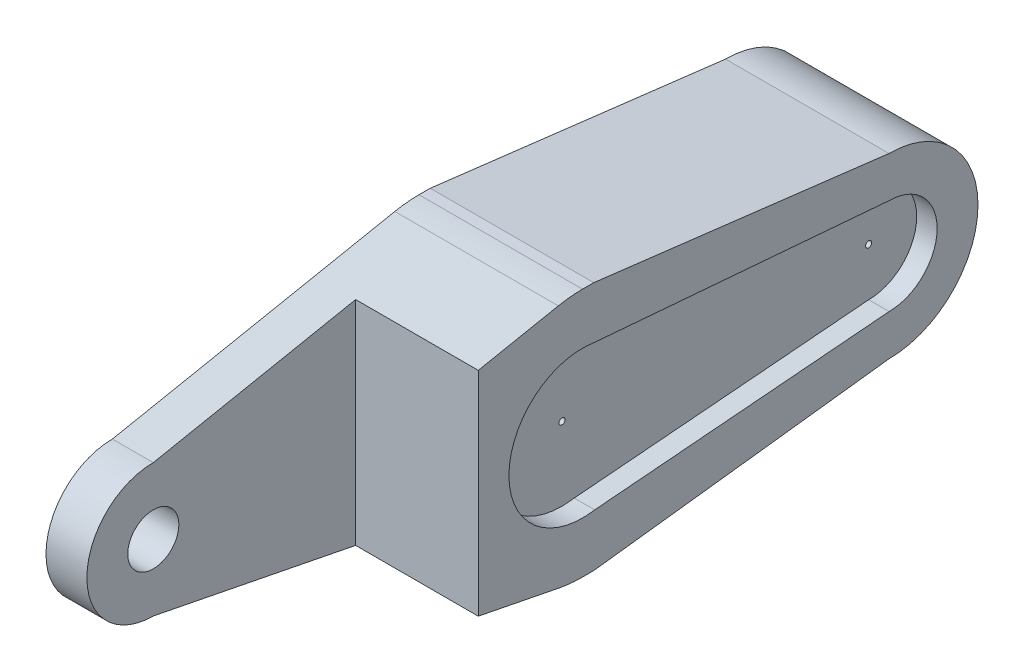
ISO-10303-21;
HEADER;
FILE_DESCRIPTION(('STEP AP214'),'2;1');
FILE_NAME('part.step','',(''),(''),'','','');
FILE_SCHEMA(('AUTOMOTIVE_DESIGN { 1 0 10303 214 1 1 1 1 }'));
ENDSEC;
DATA;
#1=APPLICATION_CONTEXT('core data for automotive mechanical design processes');
#2=APPLICATION_PROTOCOL_DEFINITION('international standard','automotive_design',2000,#1);
#3=PRODUCT_CONTEXT('',#1,'mechanical');
#4=PRODUCT('Part','Part','',(#3));
#5=PRODUCT_RELATED_PRODUCT_CATEGORY('part','',(#4));
#6=PRODUCT_DEFINITION_FORMATION('','',#4);
#7=PRODUCT_DEFINITION_CONTEXT('part definition',#1,'design');
#8=PRODUCT_DEFINITION('design','',#6,#7);
#9=PRODUCT_DEFINITION_SHAPE('','',#8);
#10=(LENGTH_UNIT() NAMED_UNIT(*) SI_UNIT(.MILLI.,.METRE.));
#11=(NAMED_UNIT(*) PLANE_ANGLE_UNIT() SI_UNIT($,.RADIAN.));
#12=(NAMED_UNIT(*) SI_UNIT($,.STERADIAN.) SOLID_ANGLE_UNIT());
#13=UNCERTAINTY_MEASURE_WITH_UNIT(LENGTH_MEASURE(1.E-05),#10,'distance_accuracy_value','');
#14=(GEOMETRIC_REPRESENTATION_CONTEXT(3) GLOBAL_UNCERTAINTY_ASSIGNED_CONTEXT((#13)) GLOBAL_UNIT_ASSIGNED_CONTEXT((#10,
#11,#12)) REPRESENTATION_CONTEXT('',''));
#15=CARTESIAN_POINT('',(0.,0.,0.));
#16=DIRECTION('',(0.,0.,1.));
#17=DIRECTION('',(1.,0.,0.));
#18=AXIS2_PLACEMENT_3D('',#15,#16,#17);
#19=CARTESIAN_POINT('',(8.,6.08869853330339,1.20486717000446));
#20=DIRECTION('',(0.,-0.980977484852086,-0.194121544948715));
#21=DIRECTION('',(0.,0.194121544948715,-0.980977484852086));
#22=AXIS2_PLACEMENT_3D('',#19,#20,#21);
#23=PLANE('',#22);
#24=DIRECTION('',(1.,0.,0.));
#25=VECTOR('',#24,1.);
#26=CARTESIAN_POINT('',(2.,5.20906972858001,5.65));
#27=LINE('',#26,#25);
#28=CARTESIAN_POINT('',(2.,5.20906972858001,5.65));
#29=VERTEX_POINT('',#28);
#30=CARTESIAN_POINT('',(8.,5.20906972858001,5.65));
#31=VERTEX_POINT('',#30);
#32=EDGE_CURVE('E179',#29,#31,#27,.T.);
#33=ORIENTED_EDGE('',*,*,#32,.T.);
#34=DIRECTION('',(0.,-0.194121544948715,0.980977484852086));
#35=VECTOR('',#34,1.);
#36=CARTESIAN_POINT('',(8.,6.08869853330339,1.20486717000446));
#37=LINE('',#36,#35);
#38=CARTESIAN_POINT('',(8.,5.98396265759772,1.73414142418716));
#39=VERTEX_POINT('',#38);
#40=EDGE_CURVE('E296',#39,#31,#37,.T.);
#41=ORIENTED_EDGE('',*,*,#40,.F.);
#42=DIRECTION('',(-1.,0.,0.));
#43=VECTOR('',#42,1.);
#44=CARTESIAN_POINT('',(8.,5.98396265759772,1.73414142418716));
#45=LINE('',#44,#43);
#46=CARTESIAN_POINT('',(0.,5.98396265759772,1.73414142418716));
#47=VERTEX_POINT('',#46);
#48=EDGE_CURVE('E57',#39,#47,#45,.T.);
#49=ORIENTED_EDGE('',*,*,#48,.T.);
#50=DIRECTION('',(0.,-0.194121544948715,0.980977484852086));
#51=VECTOR('',#50,1.);
#52=CARTESIAN_POINT('',(0.,6.08869853330339,1.20486717000446));
#53=LINE('',#52,#51);
#54=CARTESIAN_POINT('',(0.,3.25,15.55));
#55=VERTEX_POINT('',#54);
#56=EDGE_CURVE('E334',#47,#55,#53,.T.);
#57=ORIENTED_EDGE('',*,*,#56,.T.);
#58=DIRECTION('',(-1.,0.,0.));
#59=VECTOR('',#58,1.);
#60=CARTESIAN_POINT('',(8.,3.25,15.55));
#61=LINE('',#60,#59);
#62=CARTESIAN_POINT('',(2.,3.25,15.55));
#63=VERTEX_POINT('',#62);
#64=EDGE_CURVE('E203',#63,#55,#61,.T.);
#65=ORIENTED_EDGE('',*,*,#64,.F.);
#66=DIRECTION('',(0.,-0.194121544948715,0.980977484852086));
#67=VECTOR('',#66,1.);
#68=CARTESIAN_POINT('',(2.,6.08869853330339,1.20486717000446));
#69=LINE('',#68,#67);
#70=EDGE_CURVE('E195',#29,#63,#69,.T.);
#71=ORIENTED_EDGE('',*,*,#70,.F.);
#72=EDGE_LOOP('',(#33,#41,#49,#57,#65,#71));
#73=FACE_BOUND('',#72,.T.);
#74=ADVANCED_FACE('F47',(#73),#23,.F.);
#75=CARTESIAN_POINT('',(8.,0.,15.55));
#76=DIRECTION('',(-1.,0.,0.));
#77=DIRECTION('',(0.,0.,1.));
#78=AXIS2_PLACEMENT_3D('',#75,#76,#77);
#79=CYLINDRICAL_SURFACE('',#78,3.25);
#80=CARTESIAN_POINT('',(2.,0.,15.55));
#81=DIRECTION('',(1.,0.,0.));
#82=DIRECTION('',(0.,0.,-1.));
#83=AXIS2_PLACEMENT_3D('',#80,#81,#82);
#84=CIRCLE('',#83,3.25);
#85=CARTESIAN_POINT('',(2.,-3.25,15.55));
#86=VERTEX_POINT('',#85);
#87=EDGE_CURVE('E205',#63,#86,#84,.T.);
#88=ORIENTED_EDGE('',*,*,#87,.F.);
#89=ORIENTED_EDGE('',*,*,#64,.T.);
#90=CARTESIAN_POINT('',(0.,0.,15.55));
#91=DIRECTION('',(1.,0.,0.));
#92=DIRECTION('',(0.,0.,-1.));
#93=AXIS2_PLACEMENT_3D('',#90,#91,#92);
#94=CIRCLE('',#93,3.25);
#95=CARTESIAN_POINT('',(0.,-3.25,15.55));
#96=VERTEX_POINT('',#95);
#97=EDGE_CURVE('E337',#55,#96,#94,.T.);
#98=ORIENTED_EDGE('',*,*,#97,.T.);
#99=DIRECTION('',(-1.,0.,0.));
#100=VECTOR('',#99,1.);
#101=CARTESIAN_POINT('',(8.,-3.25,15.55));
#102=LINE('',#101,#100);
#103=EDGE_CURVE('E382',#86,#96,#102,.T.);
#104=ORIENTED_EDGE('',*,*,#103,.F.);
#105=EDGE_LOOP('',(#88,#89,#98,#104));
#106=FACE_BOUND('',#105,.T.);
#107=ADVANCED_FACE('F477',(#106),#79,.T.);
#108=CARTESIAN_POINT('',(8.,-6.08869853330339,1.20486717000446));
#109=DIRECTION('',(0.,0.980977484852086,-0.194121544948715));
#110=DIRECTION('',(0.,0.194121544948715,0.980977484852086));
#111=AXIS2_PLACEMENT_3D('',#108,#109,#110);
#112=PLANE('',#111);
#113=DIRECTION('',(1.,0.,0.));
#114=VECTOR('',#113,1.);
#115=CARTESIAN_POINT('',(2.,-5.20906972858001,5.65));
#116=LINE('',#115,#114);
#117=CARTESIAN_POINT('',(2.,-5.20906972858001,5.65));
#118=VERTEX_POINT('',#117);
#119=CARTESIAN_POINT('',(8.,-5.20906972858001,5.65));
#120=VERTEX_POINT('',#119);
#121=EDGE_CURVE('E65',#118,#120,#116,.T.);
#122=ORIENTED_EDGE('',*,*,#121,.F.);
#123=DIRECTION('',(0.,-0.194121544948715,-0.980977484852086));
#124=VECTOR('',#123,1.);
#125=CARTESIAN_POINT('',(2.,-6.08869853330339,1.20486717000446));
#126=LINE('',#125,#124);
#127=EDGE_CURVE('E198',#86,#118,#126,.T.);
#128=ORIENTED_EDGE('',*,*,#127,.F.);
#129=ORIENTED_EDGE('',*,*,#103,.T.);
#130=DIRECTION('',(0.,-0.194121544948715,-0.980977484852086));
#131=VECTOR('',#130,1.);
#132=CARTESIAN_POINT('',(0.,-6.08869853330339,1.20486717000446));
#133=LINE('',#132,#131);
#134=CARTESIAN_POINT('',(0.,-5.98396265759773,1.73414142418716));
#135=VERTEX_POINT('',#134);
#136=EDGE_CURVE('E341',#96,#135,#133,.T.);
#137=ORIENTED_EDGE('',*,*,#136,.T.);
#138=DIRECTION('',(-1.,0.,0.));
#139=VECTOR('',#138,1.);
#140=CARTESIAN_POINT('',(8.,-5.98396265759773,1.73414142418716));
#141=LINE('',#140,#139);
#142=CARTESIAN_POINT('',(8.,-5.98396265759773,1.73414142418716));
#143=VERTEX_POINT('',#142);
#144=EDGE_CURVE('E378',#143,#135,#141,.T.);
#145=ORIENTED_EDGE('',*,*,#144,.F.);
#146=DIRECTION('',(0.,-0.194121544948715,-0.980977484852086));
#147=VECTOR('',#146,1.);
#148=CARTESIAN_POINT('',(8.,-6.08869853330339,1.20486717000446));
#149=LINE('',#148,#147);
#150=EDGE_CURVE('E299',#120,#143,#149,.T.);
#151=ORIENTED_EDGE('',*,*,#150,.F.);
#152=EDGE_LOOP('',(#122,#128,#129,#137,#145,#151));
#153=FACE_BOUND('',#152,.T.);
#154=ADVANCED_FACE('F473',(#153),#112,.F.);
#155=CARTESIAN_POINT('',(8.,0.,15.55));
#156=DIRECTION('',(-1.,0.,0.));
#157=DIRECTION('',(0.,0.,1.));
#158=AXIS2_PLACEMENT_3D('',#155,#156,#157);
#159=CYLINDRICAL_SURFACE('',#158,1.25);
#160=CARTESIAN_POINT('',(0.,0.,15.55));
#161=DIRECTION('',(1.,0.,0.));
#162=DIRECTION('',(0.,0.,-1.));
#163=AXIS2_PLACEMENT_3D('',#160,#161,#162);
#164=CIRCLE('',#163,1.25);
#165=CARTESIAN_POINT('',(0.,0.,14.3));
#166=VERTEX_POINT('',#165);
#167=EDGE_CURVE('E271',#166,#166,#164,.T.);
#168=ORIENTED_EDGE('',*,*,#167,.F.);
#169=EDGE_LOOP('',(#168));
#170=FACE_BOUND('',#169,.T.);
#171=CARTESIAN_POINT('',(2.,0.,15.55));
#172=DIRECTION('',(1.,0.,0.));
#173=DIRECTION('',(0.,0.,-1.));
#174=AXIS2_PLACEMENT_3D('',#171,#172,#173);
#175=CIRCLE('',#174,1.25);
#176=CARTESIAN_POINT('',(2.,0.,14.3));
#177=VERTEX_POINT('',#176);
#178=EDGE_CURVE('E190',#177,#177,#175,.F.);
#179=ORIENTED_EDGE('',*,*,#178,.F.);
#180=EDGE_LOOP('',(#179));
#181=FACE_BOUND('',#180,.T.);
#182=ADVANCED_FACE('F49',(#170,#181),#159,.F.);
#183=CARTESIAN_POINT('',(8.,0.,0.));
#184=DIRECTION('',(1.,0.,0.));
#185=DIRECTION('',(0.,0.,-1.));
#186=AXIS2_PLACEMENT_3D('',#183,#184,#185);
#187=PLANE('',#186);
#188=CARTESIAN_POINT('',(8.,0.,-14.45));
#189=DIRECTION('',(1.,0.,0.));
#190=DIRECTION('',(0.,0.,-1.));
#191=AXIS2_PLACEMENT_3D('',#188,#189,#190);
#192=CIRCLE('',#191,2.35);
#193=CARTESIAN_POINT('',(8.,-2.35,-14.45));
#194=VERTEX_POINT('',#193);
#195=CARTESIAN_POINT('',(8.,2.35,-14.45));
#196=VERTEX_POINT('',#195);
#197=EDGE_CURVE('E272',#194,#196,#192,.T.);
#198=ORIENTED_EDGE('',*,*,#197,.F.);
#199=DIRECTION('',(0.,0.08304547985374,-0.99654575824488));
#200=VECTOR('',#199,1.);
#201=CARTESIAN_POINT('',(8.,-3.52965517241379,-0.294137931034483));
#202=LINE('',#201,#200);
#203=CARTESIAN_POINT('',(8.,-3.55034482758621,-0.0458620689654945));
#204=VERTEX_POINT('',#203);
#205=EDGE_CURVE('E276',#204,#194,#202,.T.);
#206=ORIENTED_EDGE('',*,*,#205,.F.);
#207=CARTESIAN_POINT('',(8.,0.,0.549999999999999));
#208=DIRECTION('',(1.,0.,0.));
#209=DIRECTION('',(0.,0.,-1.));
#210=AXIS2_PLACEMENT_3D('',#207,#208,#209);
#211=CIRCLE('',#210,3.6);
#212=CARTESIAN_POINT('',(8.,3.55034482758621,-0.0458620689654861));
#213=VERTEX_POINT('',#212);
#214=EDGE_CURVE('E281',#213,#204,#211,.T.);
#215=ORIENTED_EDGE('',*,*,#214,.F.);
#216=DIRECTION('',(0.,0.08304547985374,0.99654575824488));
#217=VECTOR('',#216,1.);
#218=CARTESIAN_POINT('',(8.,3.52965517241379,-0.294137931034483));
#219=LINE('',#218,#217);
#220=EDGE_CURVE('E285',#196,#213,#219,.T.);
#221=ORIENTED_EDGE('',*,*,#220,.F.);
#222=EDGE_LOOP('',(#198,#206,#215,#221));
#223=FACE_BOUND('',#222,.T.);
#224=ORIENTED_EDGE('',*,*,#40,.T.);
#225=DIRECTION('',(0.,-1.,0.));
#226=VECTOR('',#225,1.);
#227=CARTESIAN_POINT('',(8.,0.,5.65));
#228=LINE('',#227,#226);
#229=EDGE_CURVE('E184',#31,#120,#228,.T.);
#230=ORIENTED_EDGE('',*,*,#229,.T.);
#231=ORIENTED_EDGE('',*,*,#150,.T.);
#232=CARTESIAN_POINT('',(8.,0.,0.549999999999999));
#233=DIRECTION('',(1.,0.,0.));
#234=DIRECTION('',(0.,0.,-1.));
#235=AXIS2_PLACEMENT_3D('',#232,#233,#234);
#236=CIRCLE('',#235,6.1);
#237=CARTESIAN_POINT('',(8.,-6.1,0.549999999999999));
#238=VERTEX_POINT('',#237);
#239=EDGE_CURVE('E302',#143,#238,#236,.T.);
#240=ORIENTED_EDGE('',*,*,#239,.T.);
#241=DIRECTION('',(0.,0.,1.));
#242=VECTOR('',#241,1.);
#243=CARTESIAN_POINT('',(8.,-6.1,0.));
#244=LINE('',#243,#242);
#245=CARTESIAN_POINT('',(8.,-6.1,0.));
#246=VERTEX_POINT('',#245);
#247=EDGE_CURVE('E305',#246,#238,#244,.T.);
#248=ORIENTED_EDGE('',*,*,#247,.F.);
#249=DIRECTION('',(0.,0.12022877994105,-0.992746211513238));
#250=VECTOR('',#249,1.);
#251=CARTESIAN_POINT('',(8.,-6.01182474689071,-0.728075661388148));
#252=LINE('',#251,#250);
#253=CARTESIAN_POINT('',(8.,-4.35,-14.45));
#254=VERTEX_POINT('',#253);
#255=EDGE_CURVE('E309',#246,#254,#252,.T.);
#256=ORIENTED_EDGE('',*,*,#255,.T.);
#257=CARTESIAN_POINT('',(8.,0.,-14.45));
#258=DIRECTION('',(1.,0.,0.));
#259=DIRECTION('',(0.,0.,-1.));
#260=AXIS2_PLACEMENT_3D('',#257,#258,#259);
#261=CIRCLE('',#260,4.35);
#262=CARTESIAN_POINT('',(8.,4.35,-14.45));
#263=VERTEX_POINT('',#262);
#264=EDGE_CURVE('E312',#254,#263,#261,.T.);
#265=ORIENTED_EDGE('',*,*,#264,.T.);
#266=DIRECTION('',(0.,0.12022877994105,0.992746211513238));
#267=VECTOR('',#266,1.);
#268=CARTESIAN_POINT('',(8.,6.01182474689071,-0.728075661388148));
#269=LINE('',#268,#267);
#270=CARTESIAN_POINT('',(8.,6.1,0.));
#271=VERTEX_POINT('',#270);
#272=EDGE_CURVE('E315',#263,#271,#269,.T.);
#273=ORIENTED_EDGE('',*,*,#272,.T.);
#274=DIRECTION('',(0.,0.,1.));
#275=VECTOR('',#274,1.);
#276=CARTESIAN_POINT('',(8.,6.1,0.));
#277=LINE('',#276,#275);
#278=CARTESIAN_POINT('',(8.,6.1,0.549999999999999));
#279=VERTEX_POINT('',#278);
#280=EDGE_CURVE('E289',#271,#279,#277,.T.);
#281=ORIENTED_EDGE('',*,*,#280,.T.);
#282=CARTESIAN_POINT('',(8.,0.,0.549999999999999));
#283=DIRECTION('',(1.,0.,0.));
#284=DIRECTION('',(0.,0.,-1.));
#285=AXIS2_PLACEMENT_3D('',#282,#283,#284);
#286=CIRCLE('',#285,6.1);
#287=EDGE_CURVE('E293',#279,#39,#286,.T.);
#288=ORIENTED_EDGE('',*,*,#287,.T.);
#289=EDGE_LOOP('',(#224,#230,#231,#240,#248,#256,#265,#273,#281,#288));
#290=FACE_BOUND('',#289,.T.);
#291=ADVANCED_FACE('F412',(#223,#290),#187,.T.);
#292=CARTESIAN_POINT('',(8.,0.,0.549999999999999));
#293=DIRECTION('',(-1.,0.,0.));
#294=DIRECTION('',(0.,0.,1.));
#295=AXIS2_PLACEMENT_3D('',#292,#293,#294);
#296=CYLINDRICAL_SURFACE('',#295,3.6);
#297=CARTESIAN_POINT('',(0.,0.,0.549999999999999));
#298=DIRECTION('',(1.,0.,0.));
#299=DIRECTION('',(0.,0.,-1.));
#300=AXIS2_PLACEMENT_3D('',#297,#298,#299);
#301=CIRCLE('',#300,3.6);
#302=CARTESIAN_POINT('',(0.,-3.6,0.549999999999999));
#303=VERTEX_POINT('',#302);
#304=CARTESIAN_POINT('',(0.,-3.55034482758621,-0.045862068965486));
#305=VERTEX_POINT('',#304);
#306=EDGE_CURVE('E322',#303,#305,#301,.T.);
#307=ORIENTED_EDGE('',*,*,#306,.F.);
#308=DIRECTION('',(-1.,0.,0.));
#309=VECTOR('',#308,1.);
#310=CARTESIAN_POINT('',(7.,-3.6,0.549999999999999));
#311=LINE('',#310,#309);
#312=CARTESIAN_POINT('',(7.,-3.6,0.549999999999999));
#313=VERTEX_POINT('',#312);
#314=EDGE_CURVE('E251',#313,#303,#311,.T.);
#315=ORIENTED_EDGE('',*,*,#314,.F.);
#316=CARTESIAN_POINT('',(7.,0.,0.549999999999999));
#317=DIRECTION('',(1.,0.,0.));
#318=DIRECTION('',(0.,0.,-1.));
#319=AXIS2_PLACEMENT_3D('',#316,#317,#318);
#320=CIRCLE('',#319,3.6);
#321=CARTESIAN_POINT('',(7.,3.6,0.549999999999999));
#322=VERTEX_POINT('',#321);
#323=EDGE_CURVE('E248',#322,#313,#320,.T.);
#324=ORIENTED_EDGE('',*,*,#323,.F.);
#325=DIRECTION('',(-1.,0.,0.));
#326=VECTOR('',#325,1.);
#327=CARTESIAN_POINT('',(7.,3.6,0.549999999999999));
#328=LINE('',#327,#326);
#329=CARTESIAN_POINT('',(0.,3.6,0.549999999999999));
#330=VERTEX_POINT('',#329);
#331=EDGE_CURVE('E259',#322,#330,#328,.T.);
#332=ORIENTED_EDGE('',*,*,#331,.T.);
#333=CARTESIAN_POINT('',(0.,3.55034482758621,-0.0458620689654861));
#334=VERTEX_POINT('',#333);
#335=EDGE_CURVE('E323',#334,#330,#301,.T.);
#336=ORIENTED_EDGE('',*,*,#335,.F.);
#337=DIRECTION('',(-1.,0.,0.));
#338=VECTOR('',#337,1.);
#339=CARTESIAN_POINT('',(8.,3.55034482758621,-0.0458620689654804));
#340=LINE('',#339,#338);
#341=CARTESIAN_POINT('',(7.,3.55034482758621,-0.0458620689654861));
#342=VERTEX_POINT('',#341);
#343=EDGE_CURVE('E263',#334,#342,#340,.F.);
#344=ORIENTED_EDGE('',*,*,#343,.T.);
#345=DIRECTION('',(-1.,0.,0.));
#346=VECTOR('',#345,1.);
#347=CARTESIAN_POINT('',(8.,3.55034482758621,-0.0458620689654861));
#348=LINE('',#347,#346);
#349=EDGE_CURVE('E393',#213,#342,#348,.T.);
#350=ORIENTED_EDGE('',*,*,#349,.F.);
#351=ORIENTED_EDGE('',*,*,#214,.T.);
#352=DIRECTION('',(-1.,0.,0.));
#353=VECTOR('',#352,1.);
#354=CARTESIAN_POINT('',(8.,-3.55034482758621,-0.0458620689654945));
#355=LINE('',#354,#353);
#356=CARTESIAN_POINT('',(7.,-3.55034482758621,-0.0458620689654945));
#357=VERTEX_POINT('',#356);
#358=EDGE_CURVE('E396',#204,#357,#355,.T.);
#359=ORIENTED_EDGE('',*,*,#358,.T.);
#360=DIRECTION('',(-1.,0.,0.));
#361=VECTOR('',#360,1.);
#362=CARTESIAN_POINT('',(8.,-3.55034482758621,-0.0458620689654888));
#363=LINE('',#362,#361);
#364=EDGE_CURVE('E267',#357,#305,#363,.T.);
#365=ORIENTED_EDGE('',*,*,#364,.T.);
#366=EDGE_LOOP('',(#307,#315,#324,#332,#336,#344,#350,#351,#359,#365));
#367=FACE_BOUND('',#366,.T.);
#368=ADVANCED_FACE('F424',(#367),#296,.F.);
#369=CARTESIAN_POINT('',(8.,6.1,0.));
#370=DIRECTION('',(0.,-1.,0.));
#371=DIRECTION('',(0.,0.,-1.));
#372=AXIS2_PLACEMENT_3D('',#369,#370,#371);
#373=PLANE('',#372);
#374=DIRECTION('',(0.,0.,1.));
#375=VECTOR('',#374,1.);
#376=CARTESIAN_POINT('',(0.,6.1,0.));
#377=LINE('',#376,#375);
#378=CARTESIAN_POINT('',(0.,6.1,0.));
#379=VERTEX_POINT('',#378);
#380=CARTESIAN_POINT('',(0.,6.1,0.549999999999999));
#381=VERTEX_POINT('',#380);
#382=EDGE_CURVE('E327',#379,#381,#377,.T.);
#383=ORIENTED_EDGE('',*,*,#382,.T.);
#384=DIRECTION('',(-1.,0.,0.));
#385=VECTOR('',#384,1.);
#386=CARTESIAN_POINT('',(8.,6.1,0.549999999999999));
#387=LINE('',#386,#385);
#388=EDGE_CURVE('E12',#279,#381,#387,.T.);
#389=ORIENTED_EDGE('',*,*,#388,.F.);
#390=ORIENTED_EDGE('',*,*,#280,.F.);
#391=DIRECTION('',(-1.,0.,0.));
#392=VECTOR('',#391,1.);
#393=CARTESIAN_POINT('',(8.,6.1,0.));
#394=LINE('',#393,#392);
#395=EDGE_CURVE('E360',#271,#379,#394,.T.);
#396=ORIENTED_EDGE('',*,*,#395,.T.);
#397=EDGE_LOOP('',(#383,#389,#390,#396));
#398=FACE_BOUND('',#397,.T.);
#399=ADVANCED_FACE('F447',(#398),#373,.F.);
#400=CARTESIAN_POINT('',(8.,0.,0.549999999999999));
#401=DIRECTION('',(-1.,0.,0.));
#402=DIRECTION('',(0.,0.,1.));
#403=AXIS2_PLACEMENT_3D('',#400,#401,#402);
#404=CYLINDRICAL_SURFACE('',#403,6.1);
#405=CARTESIAN_POINT('',(0.,0.,0.549999999999999));
#406=DIRECTION('',(1.,0.,0.));
#407=DIRECTION('',(0.,0.,-1.));
#408=AXIS2_PLACEMENT_3D('',#405,#406,#407);
#409=CIRCLE('',#408,6.1);
#410=EDGE_CURVE('E331',#381,#47,#409,.T.);
#411=ORIENTED_EDGE('',*,*,#410,.T.);
#412=ORIENTED_EDGE('',*,*,#48,.F.);
#413=ORIENTED_EDGE('',*,*,#287,.F.);
#414=ORIENTED_EDGE('',*,*,#388,.T.);
#415=EDGE_LOOP('',(#411,#412,#413,#414));
#416=FACE_BOUND('',#415,.T.);
#417=ADVANCED_FACE('F480',(#416),#404,.T.);
#418=CARTESIAN_POINT('',(8.,0.,0.549999999999999));
#419=DIRECTION('',(-1.,0.,0.));
#420=DIRECTION('',(0.,0.,1.));
#421=AXIS2_PLACEMENT_3D('',#418,#419,#420);
#422=CYLINDRICAL_SURFACE('',#421,6.1);
#423=CARTESIAN_POINT('',(0.,0.,0.549999999999999));
#424=DIRECTION('',(1.,0.,0.));
#425=DIRECTION('',(0.,0.,-1.));
#426=AXIS2_PLACEMENT_3D('',#423,#424,#425);
#427=CIRCLE('',#426,6.1);
#428=CARTESIAN_POINT('',(0.,-6.1,0.549999999999999));
#429=VERTEX_POINT('',#428);
#430=EDGE_CURVE('E344',#135,#429,#427,.T.);
#431=ORIENTED_EDGE('',*,*,#430,.T.);
#432=DIRECTION('',(-1.,0.,0.));
#433=VECTOR('',#432,1.);
#434=CARTESIAN_POINT('',(8.,-6.1,0.549999999999999));
#435=LINE('',#434,#433);
#436=EDGE_CURVE('E375',#238,#429,#435,.T.);
#437=ORIENTED_EDGE('',*,*,#436,.F.);
#438=ORIENTED_EDGE('',*,*,#239,.F.);
#439=ORIENTED_EDGE('',*,*,#144,.T.);
#440=EDGE_LOOP('',(#431,#437,#438,#439));
#441=FACE_BOUND('',#440,.T.);
#442=ADVANCED_FACE('F468',(#441),#422,.T.);
#443=CARTESIAN_POINT('',(8.,-6.1,0.));
#444=DIRECTION('',(0.,-1.,0.));
#445=DIRECTION('',(0.,0.,-1.));
#446=AXIS2_PLACEMENT_3D('',#443,#444,#445);
#447=PLANE('',#446);
#448=DIRECTION('',(0.,0.,1.));
#449=VECTOR('',#448,1.);
#450=CARTESIAN_POINT('',(0.,-6.1,0.));
#451=LINE('',#450,#449);
#452=CARTESIAN_POINT('',(0.,-6.1,0.));
#453=VERTEX_POINT('',#452);
#454=EDGE_CURVE('E348',#453,#429,#451,.T.);
#455=ORIENTED_EDGE('',*,*,#454,.F.);
#456=DIRECTION('',(-1.,0.,0.));
#457=VECTOR('',#456,1.);
#458=CARTESIAN_POINT('',(8.,-6.1,0.));
#459=LINE('',#458,#457);
#460=EDGE_CURVE('E372',#246,#453,#459,.T.);
#461=ORIENTED_EDGE('',*,*,#460,.F.);
#462=ORIENTED_EDGE('',*,*,#247,.T.);
#463=ORIENTED_EDGE('',*,*,#436,.T.);
#464=EDGE_LOOP('',(#455,#461,#462,#463));
#465=FACE_BOUND('',#464,.T.);
#466=ADVANCED_FACE('F462',(#465),#447,.T.);
#467=CARTESIAN_POINT('',(8.,-6.01182474689071,-0.728075661388148));
#468=DIRECTION('',(0.,0.992746211513238,0.12022877994105));
#469=DIRECTION('',(0.,-0.12022877994105,0.992746211513238));
#470=AXIS2_PLACEMENT_3D('',#467,#468,#469);
#471=PLANE('',#470);
#472=DIRECTION('',(0.,0.12022877994105,-0.992746211513238));
#473=VECTOR('',#472,1.);
#474=CARTESIAN_POINT('',(0.,-6.01182474689071,-0.728075661388148));
#475=LINE('',#474,#473);
#476=CARTESIAN_POINT('',(0.,-4.35,-14.45));
#477=VERTEX_POINT('',#476);
#478=EDGE_CURVE('E352',#453,#477,#475,.T.);
#479=ORIENTED_EDGE('',*,*,#478,.T.);
#480=DIRECTION('',(-1.,0.,0.));
#481=VECTOR('',#480,1.);
#482=CARTESIAN_POINT('',(8.,-4.35,-14.45));
#483=LINE('',#482,#481);
#484=EDGE_CURVE('E368',#254,#477,#483,.T.);
#485=ORIENTED_EDGE('',*,*,#484,.F.);
#486=ORIENTED_EDGE('',*,*,#255,.F.);
#487=ORIENTED_EDGE('',*,*,#460,.T.);
#488=EDGE_LOOP('',(#479,#485,#486,#487));
#489=FACE_BOUND('',#488,.T.);
#490=ADVANCED_FACE('F481',(#489),#471,.F.);
#491=CARTESIAN_POINT('',(8.,0.,-14.45));
#492=DIRECTION('',(-1.,0.,0.));
#493=DIRECTION('',(0.,0.,1.));
#494=AXIS2_PLACEMENT_3D('',#491,#492,#493);
#495=CYLINDRICAL_SURFACE('',#494,4.35);
#496=CARTESIAN_POINT('',(0.,0.,-14.45));
#497=DIRECTION('',(1.,0.,0.));
#498=DIRECTION('',(0.,0.,-1.));
#499=AXIS2_PLACEMENT_3D('',#496,#497,#498);
#500=CIRCLE('',#499,4.35);
#501=CARTESIAN_POINT('',(0.,4.35,-14.45));
#502=VERTEX_POINT('',#501);
#503=EDGE_CURVE('E355',#477,#502,#500,.T.);
#504=ORIENTED_EDGE('',*,*,#503,.T.);
#505=DIRECTION('',(-1.,0.,0.));
#506=VECTOR('',#505,1.);
#507=CARTESIAN_POINT('',(8.,4.35,-14.45));
#508=LINE('',#507,#506);
#509=EDGE_CURVE('E364',#263,#502,#508,.T.);
#510=ORIENTED_EDGE('',*,*,#509,.F.);
#511=ORIENTED_EDGE('',*,*,#264,.F.);
#512=ORIENTED_EDGE('',*,*,#484,.T.);
#513=EDGE_LOOP('',(#504,#510,#511,#512));
#514=FACE_BOUND('',#513,.T.);
#515=ADVANCED_FACE('F455',(#514),#495,.T.);
#516=CARTESIAN_POINT('',(8.,0.,-14.45));
#517=DIRECTION('',(-1.,0.,0.));
#518=DIRECTION('',(0.,0.,1.));
#519=AXIS2_PLACEMENT_3D('',#516,#517,#518);
#520=CYLINDRICAL_SURFACE('',#519,2.35);
#521=CARTESIAN_POINT('',(7.,0.,-14.45));
#522=DIRECTION('',(1.,0.,0.));
#523=DIRECTION('',(0.,0.,-1.));
#524=AXIS2_PLACEMENT_3D('',#521,#522,#523);
#525=CIRCLE('',#524,2.35);
#526=CARTESIAN_POINT('',(7.,-2.35,-14.45));
#527=VERTEX_POINT('',#526);
#528=CARTESIAN_POINT('',(7.,2.35,-14.45));
#529=VERTEX_POINT('',#528);
#530=EDGE_CURVE('E239',#527,#529,#525,.T.);
#531=ORIENTED_EDGE('',*,*,#530,.F.);
#532=DIRECTION('',(-1.,0.,0.));
#533=VECTOR('',#532,1.);
#534=CARTESIAN_POINT('',(8.,-2.35,-14.45));
#535=LINE('',#534,#533);
#536=EDGE_CURVE('E51',#194,#527,#535,.T.);
#537=ORIENTED_EDGE('',*,*,#536,.F.);
#538=ORIENTED_EDGE('',*,*,#197,.T.);
#539=DIRECTION('',(-1.,0.,0.));
#540=VECTOR('',#539,1.);
#541=CARTESIAN_POINT('',(8.,2.35,-14.45));
#542=LINE('',#541,#540);
#543=EDGE_CURVE('E318',#196,#529,#542,.T.);
#544=ORIENTED_EDGE('',*,*,#543,.T.);
#545=EDGE_LOOP('',(#531,#537,#538,#544));
#546=FACE_BOUND('',#545,.T.);
#547=ADVANCED_FACE('F409',(#546),#520,.F.);
#548=CARTESIAN_POINT('',(8.,-3.52965517241379,-0.294137931034483));
#549=DIRECTION('',(0.,0.99654575824488,0.0830454798537399));
#550=DIRECTION('',(0.,-0.08304547985374,0.99654575824488));
#551=AXIS2_PLACEMENT_3D('',#548,#549,#550);
#552=PLANE('',#551);
#553=DIRECTION('',(0.,0.08304547985374,-0.99654575824488));
#554=VECTOR('',#553,1.);
#555=CARTESIAN_POINT('',(7.,-3.52965517241379,-0.294137931034483));
#556=LINE('',#555,#554);
#557=EDGE_CURVE('E240',#357,#527,#556,.T.);
#558=ORIENTED_EDGE('',*,*,#557,.F.);
#559=ORIENTED_EDGE('',*,*,#358,.F.);
#560=ORIENTED_EDGE('',*,*,#205,.T.);
#561=ORIENTED_EDGE('',*,*,#536,.T.);
#562=EDGE_LOOP('',(#558,#559,#560,#561));
#563=FACE_BOUND('',#562,.T.);
#564=ADVANCED_FACE('F404',(#563),#552,.T.);
#565=CARTESIAN_POINT('',(8.,3.52965517241379,-0.294137931034483));
#566=DIRECTION('',(0.,-0.99654575824488,0.0830454798537399));
#567=DIRECTION('',(0.,-0.08304547985374,-0.99654575824488));
#568=AXIS2_PLACEMENT_3D('',#565,#566,#567);
#569=PLANE('',#568);
#570=DIRECTION('',(0.,0.08304547985374,0.99654575824488));
#571=VECTOR('',#570,1.);
#572=CARTESIAN_POINT('',(7.,3.52965517241379,-0.294137931034483));
#573=LINE('',#572,#571);
#574=EDGE_CURVE('E244',#529,#342,#573,.T.);
#575=ORIENTED_EDGE('',*,*,#574,.F.);
#576=ORIENTED_EDGE('',*,*,#543,.F.);
#577=ORIENTED_EDGE('',*,*,#220,.T.);
#578=ORIENTED_EDGE('',*,*,#349,.T.);
#579=EDGE_LOOP('',(#575,#576,#577,#578));
#580=FACE_BOUND('',#579,.T.);
#581=ADVANCED_FACE('F417',(#580),#569,.T.);
#582=CARTESIAN_POINT('',(8.,6.01182474689071,-0.728075661388148));
#583=DIRECTION('',(0.,-0.992746211513238,0.12022877994105));
#584=DIRECTION('',(0.,-0.12022877994105,-0.992746211513238));
#585=AXIS2_PLACEMENT_3D('',#582,#583,#584);
#586=PLANE('',#585);
#587=DIRECTION('',(0.,0.12022877994105,0.992746211513238));
#588=VECTOR('',#587,1.);
#589=CARTESIAN_POINT('',(0.,6.01182474689071,-0.728075661388148));
#590=LINE('',#589,#588);
#591=EDGE_CURVE('E277',#502,#379,#590,.T.);
#592=ORIENTED_EDGE('',*,*,#591,.T.);
#593=ORIENTED_EDGE('',*,*,#395,.F.);
#594=ORIENTED_EDGE('',*,*,#272,.F.);
#595=ORIENTED_EDGE('',*,*,#509,.T.);
#596=EDGE_LOOP('',(#592,#593,#594,#595));
#597=FACE_BOUND('',#596,.T.);
#598=ADVANCED_FACE('F438',(#597),#586,.F.);
#599=CARTESIAN_POINT('',(0.,0.,0.));
#600=DIRECTION('',(1.,0.,0.));
#601=DIRECTION('',(0.,0.,-1.));
#602=AXIS2_PLACEMENT_3D('',#599,#600,#601);
#603=PLANE('',#602);
#604=CARTESIAN_POINT('',(0.,0.,0.549999999999999));
#605=DIRECTION('',(1.,0.,0.));
#606=DIRECTION('',(0.,0.,-1.));
#607=AXIS2_PLACEMENT_3D('',#604,#605,#606);
#608=CIRCLE('',#607,0.15);
#609=CARTESIAN_POINT('',(0.,0.,0.4));
#610=VERTEX_POINT('',#609);
#611=EDGE_CURVE('E220',#610,#610,#608,.T.);
#612=ORIENTED_EDGE('',*,*,#611,.T.);
#613=EDGE_LOOP('',(#612));
#614=FACE_BOUND('',#613,.T.);
#615=CARTESIAN_POINT('',(0.,0.,-14.45));
#616=DIRECTION('',(1.,0.,0.));
#617=DIRECTION('',(0.,0.,-1.));
#618=AXIS2_PLACEMENT_3D('',#615,#616,#617);
#619=CIRCLE('',#618,0.150000000000001);
#620=CARTESIAN_POINT('',(0.,0.,-14.6));
#621=VERTEX_POINT('',#620);
#622=EDGE_CURVE('E218',#621,#621,#619,.T.);
#623=ORIENTED_EDGE('',*,*,#622,.T.);
#624=EDGE_LOOP('',(#623));
#625=FACE_BOUND('',#624,.T.);
#626=DIRECTION('',(0.,0.08304547985374,0.99654575824488));
#627=VECTOR('',#626,1.);
#628=CARTESIAN_POINT('',(0.,3.52965517241379,-0.294137931034483));
#629=LINE('',#628,#627);
#630=EDGE_CURVE('E254',#334,#330,#629,.T.);
#631=ORIENTED_EDGE('',*,*,#630,.F.);
#632=ORIENTED_EDGE('',*,*,#335,.T.);
#633=EDGE_LOOP('',(#631,#632));
#634=FACE_BOUND('',#633,.T.);
#635=ORIENTED_EDGE('',*,*,#167,.T.);
#636=EDGE_LOOP('',(#635));
#637=FACE_BOUND('',#636,.T.);
#638=ORIENTED_EDGE('',*,*,#306,.T.);
#639=DIRECTION('',(0.,0.08304547985374,-0.99654575824488));
#640=VECTOR('',#639,1.);
#641=CARTESIAN_POINT('',(0.,-3.52965517241379,-0.294137931034483));
#642=LINE('',#641,#640);
#643=EDGE_CURVE('E72',#303,#305,#642,.T.);
#644=ORIENTED_EDGE('',*,*,#643,.F.);
#645=EDGE_LOOP('',(#638,#644));
#646=FACE_BOUND('',#645,.T.);
#647=ORIENTED_EDGE('',*,*,#382,.F.);
#648=ORIENTED_EDGE('',*,*,#591,.F.);
#649=ORIENTED_EDGE('',*,*,#503,.F.);
#650=ORIENTED_EDGE('',*,*,#478,.F.);
#651=ORIENTED_EDGE('',*,*,#454,.T.);
#652=ORIENTED_EDGE('',*,*,#430,.F.);
#653=ORIENTED_EDGE('',*,*,#136,.F.);
#654=ORIENTED_EDGE('',*,*,#97,.F.);
#655=ORIENTED_EDGE('',*,*,#56,.F.);
#656=ORIENTED_EDGE('',*,*,#410,.F.);
#657=EDGE_LOOP('',(#647,#648,#649,#650,#651,#652,#653,#654,#655,#656));
#658=FACE_BOUND('',#657,.T.);
#659=ADVANCED_FACE('F435',(#614,#625,#634,#637,#646,#658),#603,.F.);
#660=CARTESIAN_POINT('',(7.,-3.52965517241379,-0.294137931034483));
#661=DIRECTION('',(0.,0.99654575824488,0.08304547985374));
#662=DIRECTION('',(0.,-0.08304547985374,0.99654575824488));
#663=AXIS2_PLACEMENT_3D('',#660,#661,#662);
#664=PLANE('',#663);
#665=ORIENTED_EDGE('',*,*,#364,.F.);
#666=EDGE_CURVE('E235',#313,#357,#556,.T.);
#667=ORIENTED_EDGE('',*,*,#666,.F.);
#668=ORIENTED_EDGE('',*,*,#314,.T.);
#669=ORIENTED_EDGE('',*,*,#643,.T.);
#670=EDGE_LOOP('',(#665,#667,#668,#669));
#671=FACE_BOUND('',#670,.T.);
#672=ADVANCED_FACE('F433',(#671),#664,.F.);
#673=CARTESIAN_POINT('',(7.,3.52965517241379,-0.294137931034483));
#674=DIRECTION('',(0.,-0.99654575824488,0.08304547985374));
#675=DIRECTION('',(0.,-0.08304547985374,-0.99654575824488));
#676=AXIS2_PLACEMENT_3D('',#673,#674,#675);
#677=PLANE('',#676);
#678=ORIENTED_EDGE('',*,*,#343,.F.);
#679=ORIENTED_EDGE('',*,*,#630,.T.);
#680=ORIENTED_EDGE('',*,*,#331,.F.);
#681=EDGE_CURVE('E243',#342,#322,#573,.T.);
#682=ORIENTED_EDGE('',*,*,#681,.F.);
#683=EDGE_LOOP('',(#678,#679,#680,#682));
#684=FACE_BOUND('',#683,.T.);
#685=ADVANCED_FACE('F426',(#684),#677,.F.);
#686=CARTESIAN_POINT('',(7.,0.,0.));
#687=DIRECTION('',(1.,0.,0.));
#688=DIRECTION('',(0.,0.,-1.));
#689=AXIS2_PLACEMENT_3D('',#686,#687,#688);
#690=PLANE('',#689);
#691=CARTESIAN_POINT('',(7.,0.,0.549999999999999));
#692=DIRECTION('',(1.,0.,0.));
#693=DIRECTION('',(0.,0.,-1.));
#694=AXIS2_PLACEMENT_3D('',#691,#692,#693);
#695=CIRCLE('',#694,0.15);
#696=CARTESIAN_POINT('',(7.,0.,0.4));
#697=VERTEX_POINT('',#696);
#698=EDGE_CURVE('E224',#697,#697,#695,.T.);
#699=ORIENTED_EDGE('',*,*,#698,.F.);
#700=EDGE_LOOP('',(#699));
#701=FACE_BOUND('',#700,.T.);
#702=CARTESIAN_POINT('',(7.,0.,-14.45));
#703=DIRECTION('',(1.,0.,0.));
#704=DIRECTION('',(0.,0.,-1.));
#705=AXIS2_PLACEMENT_3D('',#702,#703,#704);
#706=CIRCLE('',#705,0.150000000000001);
#707=CARTESIAN_POINT('',(7.,0.,-14.6));
#708=VERTEX_POINT('',#707);
#709=EDGE_CURVE('E228',#708,#708,#706,.T.);
#710=ORIENTED_EDGE('',*,*,#709,.F.);
#711=EDGE_LOOP('',(#710));
#712=FACE_BOUND('',#711,.T.);
#713=ORIENTED_EDGE('',*,*,#666,.T.);
#714=ORIENTED_EDGE('',*,*,#557,.T.);
#715=ORIENTED_EDGE('',*,*,#530,.T.);
#716=ORIENTED_EDGE('',*,*,#574,.T.);
#717=ORIENTED_EDGE('',*,*,#681,.T.);
#718=ORIENTED_EDGE('',*,*,#323,.T.);
#719=EDGE_LOOP('',(#713,#714,#715,#716,#717,#718));
#720=FACE_BOUND('',#719,.T.);
#721=ADVANCED_FACE('F419',(#701,#712,#720),#690,.T.);
#722=CARTESIAN_POINT('',(0.,0.,-14.45));
#723=DIRECTION('',(1.,0.,0.));
#724=DIRECTION('',(0.,0.,-1.));
#725=AXIS2_PLACEMENT_3D('',#722,#723,#724);
#726=CYLINDRICAL_SURFACE('',#725,0.150000000000001);
#727=ORIENTED_EDGE('',*,*,#622,.F.);
#728=EDGE_LOOP('',(#727));
#729=FACE_BOUND('',#728,.T.);
#730=ORIENTED_EDGE('',*,*,#709,.T.);
#731=EDGE_LOOP('',(#730));
#732=FACE_BOUND('',#731,.T.);
#733=ADVANCED_FACE('F553',(#729,#732),#726,.F.);
#734=CARTESIAN_POINT('',(0.,0.,0.549999999999999));
#735=DIRECTION('',(1.,0.,0.));
#736=DIRECTION('',(0.,0.,-1.));
#737=AXIS2_PLACEMENT_3D('',#734,#735,#736);
#738=CYLINDRICAL_SURFACE('',#737,0.15);
#739=ORIENTED_EDGE('',*,*,#611,.F.);
#740=EDGE_LOOP('',(#739));
#741=FACE_BOUND('',#740,.T.);
#742=ORIENTED_EDGE('',*,*,#698,.T.);
#743=EDGE_LOOP('',(#742));
#744=FACE_BOUND('',#743,.T.);
#745=ADVANCED_FACE('F561',(#741,#744),#738,.F.);
#746=CARTESIAN_POINT('',(2.,0.,5.65));
#747=DIRECTION('',(0.,0.,1.));
#748=DIRECTION('',(0.,-1.,0.));
#749=AXIS2_PLACEMENT_3D('',#746,#747,#748);
#750=PLANE('',#749);
#751=ORIENTED_EDGE('',*,*,#229,.F.);
#752=ORIENTED_EDGE('',*,*,#32,.F.);
#753=DIRECTION('',(0.,-1.,0.));
#754=VECTOR('',#753,1.);
#755=CARTESIAN_POINT('',(2.,0.,5.65));
#756=LINE('',#755,#754);
#757=EDGE_CURVE('E182',#29,#118,#756,.T.);
#758=ORIENTED_EDGE('',*,*,#757,.T.);
#759=ORIENTED_EDGE('',*,*,#121,.T.);
#760=EDGE_LOOP('',(#751,#752,#758,#759));
#761=FACE_BOUND('',#760,.T.);
#762=ADVANCED_FACE('F181',(#761),#750,.T.);
#763=CARTESIAN_POINT('',(2.,0.,0.));
#764=DIRECTION('',(1.,0.,0.));
#765=DIRECTION('',(0.,0.,-1.));
#766=AXIS2_PLACEMENT_3D('',#763,#764,#765);
#767=PLANE('',#766);
#768=ORIENTED_EDGE('',*,*,#757,.F.);
#769=ORIENTED_EDGE('',*,*,#70,.T.);
#770=ORIENTED_EDGE('',*,*,#87,.T.);
#771=ORIENTED_EDGE('',*,*,#127,.T.);
#772=EDGE_LOOP('',(#768,#769,#770,#771));
#773=FACE_BOUND('',#772,.T.);
#774=ORIENTED_EDGE('',*,*,#178,.T.);
#775=EDGE_LOOP('',(#774));
#776=FACE_BOUND('',#775,.T.);
#777=ADVANCED_FACE('F193',(#773,#776),#767,.T.);
#778=CLOSED_SHELL('',(#74,#107,#154,#182,#291,#368,#399,#417,#442,#466,#490,#515,#547,#564,#581,
#598,#659,#672,#685,#721,#733,#745,#762,#777));
#779=MANIFOLD_SOLID_BREP('B2',#778);
#780=ADVANCED_BREP_SHAPE_REPRESENTATION('',(#18,#779),#14);
#781=SHAPE_DEFINITION_REPRESENTATION(#9,#780);
ENDSEC;
END-ISO-10303-21;
